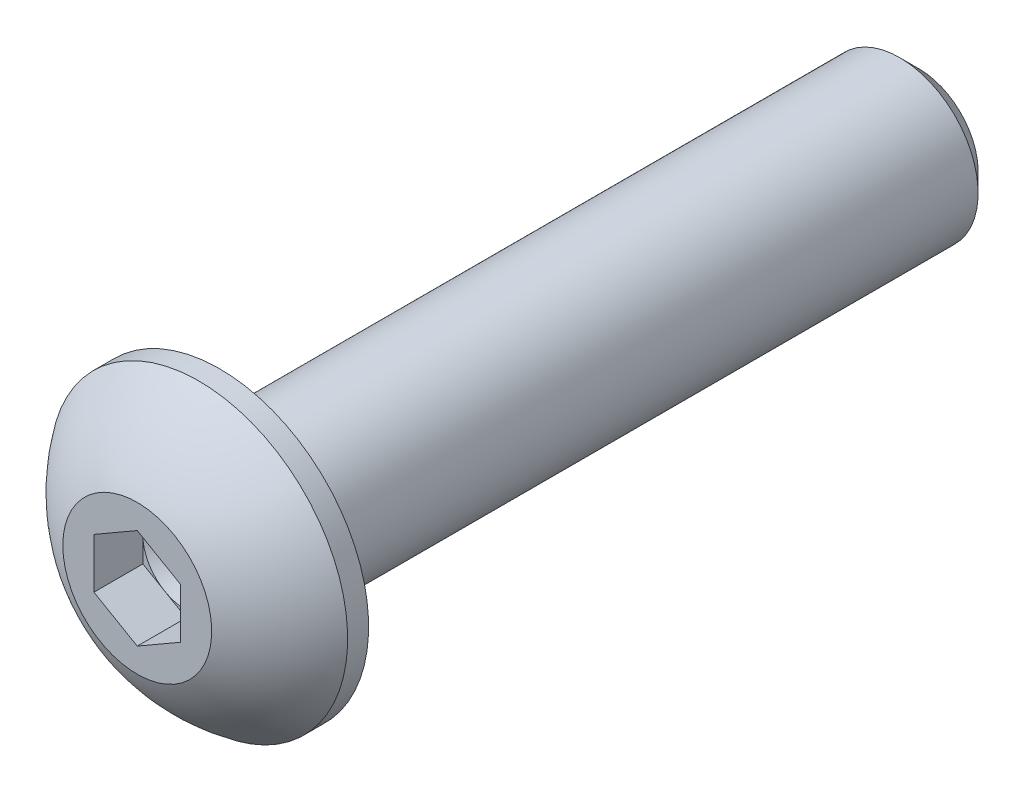
ISO-10303-21;
HEADER;
FILE_DESCRIPTION(('STEP AP214'),'2;1');
FILE_NAME('part.step','',(''),(''),'','','');
FILE_SCHEMA(('AUTOMOTIVE_DESIGN { 1 0 10303 214 1 1 1 1 }'));
ENDSEC;
DATA;
#1=APPLICATION_CONTEXT('core data for automotive mechanical design processes');
#2=APPLICATION_PROTOCOL_DEFINITION('international standard','automotive_design',2000,#1);
#3=PRODUCT_CONTEXT('',#1,'mechanical');
#4=PRODUCT('Part','Part','',(#3));
#5=PRODUCT_RELATED_PRODUCT_CATEGORY('part','',(#4));
#6=PRODUCT_DEFINITION_FORMATION('','',#4);
#7=PRODUCT_DEFINITION_CONTEXT('part definition',#1,'design');
#8=PRODUCT_DEFINITION('design','',#6,#7);
#9=PRODUCT_DEFINITION_SHAPE('','',#8);
#10=(LENGTH_UNIT() NAMED_UNIT(*) SI_UNIT(.MILLI.,.METRE.));
#11=(NAMED_UNIT(*) PLANE_ANGLE_UNIT() SI_UNIT($,.RADIAN.));
#12=(NAMED_UNIT(*) SI_UNIT($,.STERADIAN.) SOLID_ANGLE_UNIT());
#13=UNCERTAINTY_MEASURE_WITH_UNIT(LENGTH_MEASURE(1.E-05),#10,'distance_accuracy_value','');
#14=(GEOMETRIC_REPRESENTATION_CONTEXT(3) GLOBAL_UNCERTAINTY_ASSIGNED_CONTEXT((#13)) GLOBAL_UNIT_ASSIGNED_CONTEXT((#10,
#11,#12)) REPRESENTATION_CONTEXT('',''));
#15=CARTESIAN_POINT('',(0.,0.,0.));
#16=DIRECTION('',(0.,0.,1.));
#17=DIRECTION('',(1.,0.,0.));
#18=AXIS2_PLACEMENT_3D('',#15,#16,#17);
#19=CARTESIAN_POINT('',(0.,0.,-0.889));
#20=DIRECTION('',(0.,0.,1.));
#21=DIRECTION('',(1.,0.,0.));
#22=AXIS2_PLACEMENT_3D('',#19,#20,#21);
#23=PLANE('',#22);
#24=CARTESIAN_POINT('',(0.,0.,-0.889));
#25=DIRECTION('',(0.,0.,1.));
#26=DIRECTION('',(1.,0.,0.));
#27=AXIS2_PLACEMENT_3D('',#24,#25,#26);
#28=CIRCLE('',#27,0.7874);
#29=CARTESIAN_POINT('',(0.7874,0.,-0.889));
#30=VERTEX_POINT('',#29);
#31=CARTESIAN_POINT('',(0.3937,0.681908402939867,-0.889));
#32=VERTEX_POINT('',#31);
#33=EDGE_CURVE('E96',#30,#32,#28,.T.);
#34=ORIENTED_EDGE('',*,*,#33,.F.);
#35=DIRECTION('',(0.,-1.,0.));
#36=VECTOR('',#35,1.);
#37=CARTESIAN_POINT('',(0.7874,0.,-0.889));
#38=LINE('',#37,#36);
#39=CARTESIAN_POINT('',(0.7874,0.454605601959912,-0.889));
#40=VERTEX_POINT('',#39);
#41=EDGE_CURVE('E120',#40,#30,#38,.T.);
#42=ORIENTED_EDGE('',*,*,#41,.F.);
#43=DIRECTION('',(0.866025403784439,-0.5,0.));
#44=VECTOR('',#43,1.);
#45=CARTESIAN_POINT('',(0.3937,0.681908402939867,-0.889));
#46=LINE('',#45,#44);
#47=EDGE_CURVE('E118',#32,#40,#46,.T.);
#48=ORIENTED_EDGE('',*,*,#47,.F.);
#49=EDGE_LOOP('',(#34,#42,#48));
#50=FACE_BOUND('',#49,.T.);
#51=ADVANCED_FACE('F17',(#50),#23,.T.);
#52=CARTESIAN_POINT('',(-0.3937,0.681908402939867,-0.889));
#53=VERTEX_POINT('',#52);
#54=EDGE_CURVE('E98',#32,#53,#28,.T.);
#55=ORIENTED_EDGE('',*,*,#54,.F.);
#56=CARTESIAN_POINT('',(0.,0.909211203919823,-0.889));
#57=VERTEX_POINT('',#56);
#58=EDGE_CURVE('E113',#57,#32,#46,.T.);
#59=ORIENTED_EDGE('',*,*,#58,.F.);
#60=DIRECTION('',(0.866025403784439,0.5,0.));
#61=VECTOR('',#60,1.);
#62=CARTESIAN_POINT('',(-0.3937,0.681908402939867,-0.889));
#63=LINE('',#62,#61);
#64=EDGE_CURVE('E114',#53,#57,#63,.T.);
#65=ORIENTED_EDGE('',*,*,#64,.F.);
#66=EDGE_LOOP('',(#55,#59,#65));
#67=FACE_BOUND('',#66,.T.);
#68=ADVANCED_FACE('F111',(#67),#23,.T.);
#69=CARTESIAN_POINT('',(-0.7874,0.,-0.889));
#70=VERTEX_POINT('',#69);
#71=EDGE_CURVE('E117',#53,#70,#28,.T.);
#72=ORIENTED_EDGE('',*,*,#71,.F.);
#73=CARTESIAN_POINT('',(-0.7874,0.454605601959911,-0.889));
#74=VERTEX_POINT('',#73);
#75=EDGE_CURVE('E135',#74,#53,#63,.T.);
#76=ORIENTED_EDGE('',*,*,#75,.F.);
#77=DIRECTION('',(0.,1.,0.));
#78=VECTOR('',#77,1.);
#79=CARTESIAN_POINT('',(-0.7874,0.,-0.889));
#80=LINE('',#79,#78);
#81=EDGE_CURVE('E139',#70,#74,#80,.T.);
#82=ORIENTED_EDGE('',*,*,#81,.F.);
#83=EDGE_LOOP('',(#72,#76,#82));
#84=FACE_BOUND('',#83,.T.);
#85=ADVANCED_FACE('F228',(#84),#23,.T.);
#86=CARTESIAN_POINT('',(-0.3937,-0.681908402939867,-0.889));
#87=VERTEX_POINT('',#86);
#88=EDGE_CURVE('E253',#70,#87,#28,.T.);
#89=ORIENTED_EDGE('',*,*,#88,.F.);
#90=CARTESIAN_POINT('',(-0.7874,-0.454605601959911,-0.889));
#91=VERTEX_POINT('',#90);
#92=EDGE_CURVE('E140',#91,#70,#80,.T.);
#93=ORIENTED_EDGE('',*,*,#92,.F.);
#94=DIRECTION('',(-0.866025403784439,0.5,0.));
#95=VECTOR('',#94,1.);
#96=CARTESIAN_POINT('',(-0.3937,-0.681908402939867,-0.889));
#97=LINE('',#96,#95);
#98=EDGE_CURVE('E144',#87,#91,#97,.T.);
#99=ORIENTED_EDGE('',*,*,#98,.F.);
#100=EDGE_LOOP('',(#89,#93,#99));
#101=FACE_BOUND('',#100,.T.);
#102=ADVANCED_FACE('F240',(#101),#23,.T.);
#103=CARTESIAN_POINT('',(0.3937,-0.681908402939867,-0.889));
#104=VERTEX_POINT('',#103);
#105=EDGE_CURVE('E33',#87,#104,#28,.T.);
#106=ORIENTED_EDGE('',*,*,#105,.F.);
#107=CARTESIAN_POINT('',(0.,-0.909211203919823,-0.889));
#108=VERTEX_POINT('',#107);
#109=EDGE_CURVE('E145',#108,#87,#97,.T.);
#110=ORIENTED_EDGE('',*,*,#109,.F.);
#111=DIRECTION('',(-0.866025403784438,-0.5,0.));
#112=VECTOR('',#111,1.);
#113=CARTESIAN_POINT('',(0.3937,-0.681908402939867,-0.889));
#114=LINE('',#113,#112);
#115=EDGE_CURVE('E149',#104,#108,#114,.T.);
#116=ORIENTED_EDGE('',*,*,#115,.F.);
#117=EDGE_LOOP('',(#106,#110,#116));
#118=FACE_BOUND('',#117,.T.);
#119=ADVANCED_FACE('F233',(#118),#23,.T.);
#120=CARTESIAN_POINT('',(-0.676275,0.,0.));
#121=DIRECTION('',(0.,0.,1.));
#122=DIRECTION('',(1.,0.,0.));
#123=AXIS2_PLACEMENT_3D('',#120,#121,#122);
#124=PLANE('',#123);
#125=CARTESIAN_POINT('',(0.,0.,0.));
#126=DIRECTION('',(0.,0.,-1.));
#127=DIRECTION('',(-1.,0.,0.));
#128=AXIS2_PLACEMENT_3D('',#125,#126,#127);
#129=CIRCLE('',#128,1.35255);
#130=CARTESIAN_POINT('',(-1.35255000000001,0.,0.));
#131=VERTEX_POINT('',#130);
#132=EDGE_CURVE('E198',#131,#131,#129,.T.);
#133=ORIENTED_EDGE('',*,*,#132,.F.);
#134=EDGE_LOOP('',(#133));
#135=FACE_BOUND('',#134,.T.);
#136=DIRECTION('',(0.866025403784439,0.5,0.));
#137=VECTOR('',#136,1.);
#138=CARTESIAN_POINT('',(-0.3937,0.681908402939867,0.));
#139=LINE('',#138,#137);
#140=CARTESIAN_POINT('',(-0.7874,0.454605601959911,0.));
#141=VERTEX_POINT('',#140);
#142=CARTESIAN_POINT('',(0.,0.909211203919823,0.));
#143=VERTEX_POINT('',#142);
#144=EDGE_CURVE('E161',#141,#143,#139,.T.);
#145=ORIENTED_EDGE('',*,*,#144,.T.);
#146=DIRECTION('',(0.866025403784439,-0.5,0.));
#147=VECTOR('',#146,1.);
#148=CARTESIAN_POINT('',(0.3937,0.681908402939867,0.));
#149=LINE('',#148,#147);
#150=CARTESIAN_POINT('',(0.7874,0.454605601959912,0.));
#151=VERTEX_POINT('',#150);
#152=EDGE_CURVE('E106',#143,#151,#149,.T.);
#153=ORIENTED_EDGE('',*,*,#152,.T.);
#154=DIRECTION('',(0.,-1.,0.));
#155=VECTOR('',#154,1.);
#156=CARTESIAN_POINT('',(0.7874,0.,0.));
#157=LINE('',#156,#155);
#158=CARTESIAN_POINT('',(0.7874,-0.454605601959912,0.));
#159=VERTEX_POINT('',#158);
#160=EDGE_CURVE('E124',#151,#159,#157,.T.);
#161=ORIENTED_EDGE('',*,*,#160,.T.);
#162=DIRECTION('',(-0.866025403784438,-0.5,0.));
#163=VECTOR('',#162,1.);
#164=CARTESIAN_POINT('',(0.3937,-0.681908402939867,0.));
#165=LINE('',#164,#163);
#166=CARTESIAN_POINT('',(0.,-0.909211203919823,0.));
#167=VERTEX_POINT('',#166);
#168=EDGE_CURVE('E41',#159,#167,#165,.T.);
#169=ORIENTED_EDGE('',*,*,#168,.T.);
#170=DIRECTION('',(-0.866025403784439,0.5,0.));
#171=VECTOR('',#170,1.);
#172=CARTESIAN_POINT('',(-0.3937,-0.681908402939867,0.));
#173=LINE('',#172,#171);
#174=CARTESIAN_POINT('',(-0.7874,-0.454605601959911,0.));
#175=VERTEX_POINT('',#174);
#176=EDGE_CURVE('E169',#167,#175,#173,.T.);
#177=ORIENTED_EDGE('',*,*,#176,.T.);
#178=DIRECTION('',(0.,1.,0.));
#179=VECTOR('',#178,1.);
#180=CARTESIAN_POINT('',(-0.7874,0.,0.));
#181=LINE('',#180,#179);
#182=EDGE_CURVE('E165',#175,#141,#181,.T.);
#183=ORIENTED_EDGE('',*,*,#182,.T.);
#184=EDGE_LOOP('',(#145,#153,#161,#169,#177,#183));
#185=FACE_BOUND('',#184,.T.);
#186=ADVANCED_FACE('F239',(#135,#185),#124,.T.);
#187=CARTESIAN_POINT('',(0.,0.,1.48381805047393));
#188=DIRECTION('',(0.,0.,-1.));
#189=DIRECTION('',(-1.,0.,0.));
#190=AXIS2_PLACEMENT_3D('',#187,#188,#189);
#191=CYLINDRICAL_SURFACE('',#190,2.7051);
#192=CARTESIAN_POINT('',(0.,0.,-1.1176));
#193=DIRECTION('',(0.,0.,-1.));
#194=DIRECTION('',(-1.,0.,0.));
#195=AXIS2_PLACEMENT_3D('',#192,#193,#194);
#196=CIRCLE('',#195,2.7051);
#197=CARTESIAN_POINT('',(-2.7051,0.,-1.1176));
#198=VERTEX_POINT('',#197);
#199=EDGE_CURVE('E194',#198,#198,#196,.T.);
#200=ORIENTED_EDGE('',*,*,#199,.T.);
#201=EDGE_LOOP('',(#200));
#202=FACE_BOUND('',#201,.T.);
#203=CARTESIAN_POINT('',(0.,0.,-1.4986));
#204=DIRECTION('',(0.,0.,-1.));
#205=DIRECTION('',(-1.,0.,0.));
#206=AXIS2_PLACEMENT_3D('',#203,#204,#205);
#207=CIRCLE('',#206,2.7051);
#208=CARTESIAN_POINT('',(-2.7051,0.,-1.4986));
#209=VERTEX_POINT('',#208);
#210=EDGE_CURVE('E209',#209,#209,#207,.T.);
#211=ORIENTED_EDGE('',*,*,#210,.F.);
#212=EDGE_LOOP('',(#211));
#213=FACE_BOUND('',#212,.T.);
#214=ADVANCED_FACE('F245',(#202,#213),#191,.T.);
#215=CARTESIAN_POINT('',(-2.19075,0.,-1.4986));
#216=DIRECTION('',(0.,0.,-1.));
#217=DIRECTION('',(-1.,0.,0.));
#218=AXIS2_PLACEMENT_3D('',#215,#216,#217);
#219=PLANE('',#218);
#220=ORIENTED_EDGE('',*,*,#210,.T.);
#221=EDGE_LOOP('',(#220));
#222=FACE_BOUND('',#221,.T.);
#223=CARTESIAN_POINT('',(0.,0.,-1.4986));
#224=DIRECTION('',(0.,0.,-1.));
#225=DIRECTION('',(-1.,0.,0.));
#226=AXIS2_PLACEMENT_3D('',#223,#224,#225);
#227=CIRCLE('',#226,1.6764);
#228=CARTESIAN_POINT('',(-1.6764,0.,-1.4986));
#229=VERTEX_POINT('',#228);
#230=EDGE_CURVE('E205',#229,#229,#227,.T.);
#231=ORIENTED_EDGE('',*,*,#230,.F.);
#232=EDGE_LOOP('',(#231));
#233=FACE_BOUND('',#232,.T.);
#234=ADVANCED_FACE('F305',(#222,#233),#219,.T.);
#235=CARTESIAN_POINT('',(0.,0.,-1.7526));
#236=DIRECTION('',(0.,0.,-1.));
#237=DIRECTION('',(-1.,0.,0.));
#238=AXIS2_PLACEMENT_3D('',#235,#236,#237);
#239=TOROIDAL_SURFACE('',#238,1.6764,0.254);
#240=ORIENTED_EDGE('',*,*,#230,.T.);
#241=EDGE_LOOP('',(#240));
#242=FACE_BOUND('',#241,.T.);
#243=CARTESIAN_POINT('',(0.,0.,-1.7526));
#244=DIRECTION('',(0.,0.,-1.));
#245=DIRECTION('',(-1.,0.,0.));
#246=AXIS2_PLACEMENT_3D('',#243,#244,#245);
#247=CIRCLE('',#246,1.4224);
#248=CARTESIAN_POINT('',(-1.4224,0.,-1.7526));
#249=VERTEX_POINT('',#248);
#250=EDGE_CURVE('E201',#249,#249,#247,.T.);
#251=ORIENTED_EDGE('',*,*,#250,.F.);
#252=EDGE_LOOP('',(#251));
#253=FACE_BOUND('',#252,.T.);
#254=ADVANCED_FACE('F301',(#242,#253),#239,.F.);
#255=CARTESIAN_POINT('',(0.,0.,1.48381805047393));
#256=DIRECTION('',(0.,0.,-1.));
#257=DIRECTION('',(-1.,0.,0.));
#258=AXIS2_PLACEMENT_3D('',#255,#256,#257);
#259=CYLINDRICAL_SURFACE('',#258,1.4224);
#260=CARTESIAN_POINT('',(0.,0.,-13.854896169375));
#261=DIRECTION('',(0.,0.,-1.));
#262=DIRECTION('',(-1.,0.,0.));
#263=AXIS2_PLACEMENT_3D('',#260,#261,#262);
#264=CIRCLE('',#263,1.4224);
#265=CARTESIAN_POINT('',(-1.4224,0.,-13.854896169375));
#266=VERTEX_POINT('',#265);
#267=EDGE_CURVE('E11',#266,#266,#264,.F.);
#268=ORIENTED_EDGE('',*,*,#267,.T.);
#269=EDGE_LOOP('',(#268));
#270=FACE_BOUND('',#269,.T.);
#271=ORIENTED_EDGE('',*,*,#250,.T.);
#272=EDGE_LOOP('',(#271));
#273=FACE_BOUND('',#272,.T.);
#274=ADVANCED_FACE('F298',(#270,#273),#259,.T.);
#275=CARTESIAN_POINT('',(-0.7112,0.,-14.1986));
#276=DIRECTION('',(0.,0.,-1.));
#277=DIRECTION('',(-1.,0.,0.));
#278=AXIS2_PLACEMENT_3D('',#275,#276,#277);
#279=PLANE('',#278);
#280=CARTESIAN_POINT('',(0.,0.,-14.1986));
#281=DIRECTION('',(0.,0.,-1.));
#282=DIRECTION('',(-1.,0.,0.));
#283=AXIS2_PLACEMENT_3D('',#280,#281,#282);
#284=CIRCLE('',#283,1.078696169375);
#285=CARTESIAN_POINT('',(-1.078696169375,0.,-14.1986));
#286=VERTEX_POINT('',#285);
#287=EDGE_CURVE('E26',#286,#286,#284,.T.);
#288=ORIENTED_EDGE('',*,*,#287,.T.);
#289=EDGE_LOOP('',(#288));
#290=FACE_BOUND('',#289,.T.);
#291=ADVANCED_FACE('F217',(#290),#279,.T.);
#292=CARTESIAN_POINT('',(0.,0.,-3.01413934659091));
#293=DIRECTION('',(0.,0.,-1.));
#294=DIRECTION('',(-1.,0.,0.));
#295=AXIS2_PLACEMENT_3D('',#292,#293,#294);
#296=SPHERICAL_SURFACE('',#295,3.30369906365085);
#297=CARTESIAN_POINT('',(-2.7051,0.,-1.1176));
#298=CARTESIAN_POINT('',(-2.69448072515173,0.,-1.10245333170204));
#299=CARTESIAN_POINT('',(-2.6837342092802,0.,-1.08739587235026));
#300=CARTESIAN_POINT('',(-2.66198978369861,0.,-1.05746357954938));
#301=CARTESIAN_POINT('',(-2.65099187398855,0.,-1.04258874610028));
#302=CARTESIAN_POINT('',(-2.62874774893787,0.,-1.01302591311507));
#303=CARTESIAN_POINT('',(-2.61750153359726,0.,-0.998337913578966));
#304=CARTESIAN_POINT('',(-2.59476397456268,0.,-0.96915288990507));
#305=CARTESIAN_POINT('',(-2.58327263086873,0.,-0.954655865767278));
#306=CARTESIAN_POINT('',(-2.56004805647789,0.,-0.925856884188922));
#307=CARTESIAN_POINT('',(-2.54831482578101,0.,-0.911554926748357));
#308=CARTESIAN_POINT('',(-2.52460978835082,0.,-0.883150113831521));
#309=CARTESIAN_POINT('',(-2.51263798161752,0.,-0.86904725835525));
#310=CARTESIAN_POINT('',(-2.48845917003253,0.,-0.841044628720583));
#311=CARTESIAN_POINT('',(-2.47625216518085,0.,-0.827144854562187));
#312=CARTESIAN_POINT('',(-2.45160640173926,0.,-0.799552309543735));
#313=CARTESIAN_POINT('',(-2.43916764314934,0.,-0.78585953868368));
#314=CARTESIAN_POINT('',(-2.41406188197738,0.,-0.758684863852871));
#315=CARTESIAN_POINT('',(-2.40139487939533,0.,-0.745202959882118));
#316=CARTESIAN_POINT('',(-2.37583620439415,0.,-0.71845382291703));
#317=CARTESIAN_POINT('',(-2.36294453197501,0.,-0.705186589922696));
#318=CARTESIAN_POINT('',(-2.33694015484621,0.,-0.678870538426824));
#319=CARTESIAN_POINT('',(-2.32382745013655,0.,-0.665821719925286));
#320=CARTESIAN_POINT('',(-2.2973847083408,0.,-0.639946179302631));
#321=CARTESIAN_POINT('',(-2.28405467125472,0.,-0.627119457181515));
#322=CARTESIAN_POINT('',(-2.25718102594315,0.,-0.601691728540148));
#323=CARTESIAN_POINT('',(-2.24363741771767,0.,-0.589090722019898));
#324=CARTESIAN_POINT('',(-2.21634045162613,0.,-0.564117980112197));
#325=CARTESIAN_POINT('',(-2.20258709376008,0.,-0.551746244724746));
#326=CARTESIAN_POINT('',(-2.17487450906973,0.,-0.52723553592286));
#327=CARTESIAN_POINT('',(-2.16091528224542,0.,-0.515096562508424));
#328=CARTESIAN_POINT('',(-2.13279489840938,0.,-0.491054802816074));
#329=CARTESIAN_POINT('',(-2.11863374139764,0.,-0.47915201653816));
#330=CARTESIAN_POINT('',(-2.09011349293469,0.,-0.455585989639197));
#331=CARTESIAN_POINT('',(-2.07575440148348,0.,-0.443922749018149));
#332=CARTESIAN_POINT('',(-2.04684233573922,0.,-0.420839104362454));
#333=CARTESIAN_POINT('',(-2.03228936144617,0.,-0.409418700327807));
#334=CARTESIAN_POINT('',(-2.00299363632234,0.,-0.386823951255064));
#335=CARTESIAN_POINT('',(-1.98825088549157,0.,-0.375649606216968));
#336=CARTESIAN_POINT('',(-1.95857976714423,0.,-0.353550128118844));
#337=CARTESIAN_POINT('',(-1.94365139962767,0.,-0.342624995058815));
#338=CARTESIAN_POINT('',(-1.91361326013479,0.,-0.321027023580069));
#339=CARTESIAN_POINT('',(-1.89850348815846,0.,-0.310354185161351));
#340=CARTESIAN_POINT('',(-1.8681068031576,0.,-0.289263814440333));
#341=CARTESIAN_POINT('',(-1.85281989013307,0.,-0.278846282138034));
#342=CARTESIAN_POINT('',(-1.82207323642989,0.,-0.258269463087292));
#343=CARTESIAN_POINT('',(-1.80661349575124,0.,-0.248110176338849));
#344=CARTESIAN_POINT('',(-1.77552554889962,0.,-0.228052714965474));
#345=CARTESIAN_POINT('',(-1.75989734272667,0.,-0.218154540340541));
#346=CARTESIAN_POINT('',(-1.72847687457993,0.,-0.198622096109889));
#347=CARTESIAN_POINT('',(-1.71268461260615,0.,-0.18898782650417));
#348=CARTESIAN_POINT('',(-1.68094048884535,0.,-0.169985910735668));
#349=CARTESIAN_POINT('',(-1.66498862705833,0.,-0.160618264572885));
#350=CARTESIAN_POINT('',(-1.63292980467793,0.,-0.142152238912209));
#351=CARTESIAN_POINT('',(-1.61682284408455,0.,-0.133053859414317));
#352=CARTESIAN_POINT('',(-1.58445836891283,0.,-0.115128934218774));
#353=CARTESIAN_POINT('',(-1.56820085433448,0.,-0.106302388521123));
#354=CARTESIAN_POINT('',(-1.53553985830296,0.,-0.0889236217692724));
#355=CARTESIAN_POINT('',(-1.51913637684979,0.,-0.0803714007150717));
#356=CARTESIAN_POINT('',(-1.48618807608146,0.,-0.0635436951621508));
#357=CARTESIAN_POINT('',(-1.46964325676629,0.,-0.0552682106634306));
#358=CARTESIAN_POINT('',(-1.4364169464938,0.,-0.0389963177478053));
#359=CARTESIAN_POINT('',(-1.41973545553648,0.,-0.0309999093309001));
#360=CARTESIAN_POINT('',(-1.38624051673977,0.,-0.0152884080914967));
#361=CARTESIAN_POINT('',(-1.36942706890038,0.,-0.00757331526899838));
#362=CARTESIAN_POINT('',(-1.35255000000001,0.,0.));
#363=B_SPLINE_CURVE_WITH_KNOTS('',3,(#297,#298,#299,#300,#301,#302,#303,#304,#305,#306,#307,
#308,#309,#310,#311,#312,#313,#314,#315,#316,#317,#318,#319,#320,#321,#322,#323,#324,#325,#326,
#327,#328,#329,#330,#331,#332,#333,#334,#335,#336,#337,#338,#339,#340,#341,#342,#343,#344,#345,
#346,#347,#348,#349,#350,#351,#352,#353,#354,#355,#356,#357,#358,#359,#360,#361,#362),
.UNSPECIFIED.,.F.,.F.,(4,2,2,2,2,2,2,2,2,2,2,2,2,2,2,2,2,2,2,2,2,2,2,2,2,2,2,2,2,2,2,2,4),(0.,
0.0554945270104909,0.110989054020981,0.166483581031473,0.221978108041963,0.277472635052454,
0.332967162062945,0.388461689073436,0.443956216083926,0.499450743094417,0.554945270104908,
0.610439797115399,0.66593432412589,0.72142885113638,0.776923378146871,0.832417905157362,
0.887912432167853,0.943406959178343,0.998901486188835,1.05439601319933,1.10989054020982,
1.16538506722031,1.2208795942308,1.27637412124129,1.33186864825178,1.38736317526227,
1.44285770227276,1.49835222928325,1.55384675629374,1.60934128330423,1.66483581031472,
1.72033033732521,1.77582486433571),.UNSPECIFIED.);
#364=EDGE_CURVE('BSEAM292',#198,#131,#363,.T.);
#365=ORIENTED_EDGE('',*,*,#199,.F.);
#366=ORIENTED_EDGE('',*,*,#132,.T.);
#367=ORIENTED_EDGE('',*,*,#364,.T.);
#368=ORIENTED_EDGE('',*,*,#364,.F.);
#369=EDGE_LOOP('',(#365,#367,#366,#368));
#370=FACE_BOUND('',#369,.T.);
#371=ADVANCED_FACE('F292',(#370),#296,.T.);
#372=CARTESIAN_POINT('',(0.3937,0.681908402939867,-0.889));
#373=DIRECTION('',(-0.5,-0.866025403784439,0.));
#374=DIRECTION('',(0.866025403784439,-0.5,0.));
#375=AXIS2_PLACEMENT_3D('',#372,#373,#374);
#376=PLANE('',#375);
#377=ORIENTED_EDGE('',*,*,#152,.F.);
#378=DIRECTION('',(0.,0.,1.));
#379=VECTOR('',#378,1.);
#380=CARTESIAN_POINT('',(0.,0.909211203919823,-0.889));
#381=LINE('',#380,#379);
#382=EDGE_CURVE('E129',#57,#143,#381,.T.);
#383=ORIENTED_EDGE('',*,*,#382,.F.);
#384=ORIENTED_EDGE('',*,*,#58,.T.);
#385=ORIENTED_EDGE('',*,*,#47,.T.);
#386=DIRECTION('',(0.,0.,1.));
#387=VECTOR('',#386,1.);
#388=CARTESIAN_POINT('',(0.7874,0.454605601959912,-0.889));
#389=LINE('',#388,#387);
#390=EDGE_CURVE('E157',#40,#151,#389,.T.);
#391=ORIENTED_EDGE('',*,*,#390,.T.);
#392=EDGE_LOOP('',(#377,#383,#384,#385,#391));
#393=FACE_BOUND('',#392,.T.);
#394=ADVANCED_FACE('F128',(#393),#376,.T.);
#395=CARTESIAN_POINT('',(-0.3937,0.681908402939867,-0.889));
#396=DIRECTION('',(0.5,-0.866025403784438,0.));
#397=DIRECTION('',(0.866025403784438,0.5,0.));
#398=AXIS2_PLACEMENT_3D('',#395,#396,#397);
#399=PLANE('',#398);
#400=ORIENTED_EDGE('',*,*,#144,.F.);
#401=DIRECTION('',(0.,0.,1.));
#402=VECTOR('',#401,1.);
#403=CARTESIAN_POINT('',(-0.7874,0.454605601959911,-0.889));
#404=LINE('',#403,#402);
#405=EDGE_CURVE('E189',#74,#141,#404,.T.);
#406=ORIENTED_EDGE('',*,*,#405,.F.);
#407=ORIENTED_EDGE('',*,*,#75,.T.);
#408=ORIENTED_EDGE('',*,*,#64,.T.);
#409=ORIENTED_EDGE('',*,*,#382,.T.);
#410=EDGE_LOOP('',(#400,#406,#407,#408,#409));
#411=FACE_BOUND('',#410,.T.);
#412=ADVANCED_FACE('F275',(#411),#399,.T.);
#413=CARTESIAN_POINT('',(-0.7874,0.,-0.889));
#414=DIRECTION('',(1.,0.,0.));
#415=DIRECTION('',(0.,0.,-1.));
#416=AXIS2_PLACEMENT_3D('',#413,#414,#415);
#417=PLANE('',#416);
#418=ORIENTED_EDGE('',*,*,#182,.F.);
#419=DIRECTION('',(0.,0.,1.));
#420=VECTOR('',#419,1.);
#421=CARTESIAN_POINT('',(-0.7874,-0.454605601959911,-0.889));
#422=LINE('',#421,#420);
#423=EDGE_CURVE('E186',#91,#175,#422,.T.);
#424=ORIENTED_EDGE('',*,*,#423,.F.);
#425=ORIENTED_EDGE('',*,*,#92,.T.);
#426=ORIENTED_EDGE('',*,*,#81,.T.);
#427=ORIENTED_EDGE('',*,*,#405,.T.);
#428=EDGE_LOOP('',(#418,#424,#425,#426,#427));
#429=FACE_BOUND('',#428,.T.);
#430=ADVANCED_FACE('F280',(#429),#417,.T.);
#431=CARTESIAN_POINT('',(-0.3937,-0.681908402939867,-0.889));
#432=DIRECTION('',(0.5,0.866025403784439,0.));
#433=DIRECTION('',(-0.866025403784439,0.5,0.));
#434=AXIS2_PLACEMENT_3D('',#431,#432,#433);
#435=PLANE('',#434);
#436=ORIENTED_EDGE('',*,*,#176,.F.);
#437=DIRECTION('',(0.,0.,1.));
#438=VECTOR('',#437,1.);
#439=CARTESIAN_POINT('',(0.,-0.909211203919823,-0.889));
#440=LINE('',#439,#438);
#441=EDGE_CURVE('E183',#108,#167,#440,.T.);
#442=ORIENTED_EDGE('',*,*,#441,.F.);
#443=ORIENTED_EDGE('',*,*,#109,.T.);
#444=ORIENTED_EDGE('',*,*,#98,.T.);
#445=ORIENTED_EDGE('',*,*,#423,.T.);
#446=EDGE_LOOP('',(#436,#442,#443,#444,#445));
#447=FACE_BOUND('',#446,.T.);
#448=ADVANCED_FACE('F262',(#447),#435,.T.);
#449=CARTESIAN_POINT('',(0.3937,-0.681908402939867,-0.889));
#450=DIRECTION('',(-0.5,0.866025403784438,0.));
#451=DIRECTION('',(-0.866025403784438,-0.5,0.));
#452=AXIS2_PLACEMENT_3D('',#449,#450,#451);
#453=PLANE('',#452);
#454=ORIENTED_EDGE('',*,*,#168,.F.);
#455=DIRECTION('',(0.,0.,1.));
#456=VECTOR('',#455,1.);
#457=CARTESIAN_POINT('',(0.7874,-0.454605601959912,-0.889));
#458=LINE('',#457,#456);
#459=CARTESIAN_POINT('',(0.7874,-0.454605601959912,-0.889));
#460=VERTEX_POINT('',#459);
#461=EDGE_CURVE('E180',#460,#159,#458,.T.);
#462=ORIENTED_EDGE('',*,*,#461,.F.);
#463=EDGE_CURVE('E150',#460,#104,#114,.T.);
#464=ORIENTED_EDGE('',*,*,#463,.T.);
#465=ORIENTED_EDGE('',*,*,#115,.T.);
#466=ORIENTED_EDGE('',*,*,#441,.T.);
#467=EDGE_LOOP('',(#454,#462,#464,#465,#466));
#468=FACE_BOUND('',#467,.T.);
#469=ADVANCED_FACE('F236',(#468),#453,.T.);
#470=CARTESIAN_POINT('',(0.7874,0.,-0.889));
#471=DIRECTION('',(-1.,0.,0.));
#472=DIRECTION('',(0.,0.,1.));
#473=AXIS2_PLACEMENT_3D('',#470,#471,#472);
#474=PLANE('',#473);
#475=ORIENTED_EDGE('',*,*,#160,.F.);
#476=ORIENTED_EDGE('',*,*,#390,.F.);
#477=ORIENTED_EDGE('',*,*,#41,.T.);
#478=EDGE_CURVE('E154',#30,#460,#38,.T.);
#479=ORIENTED_EDGE('',*,*,#478,.T.);
#480=ORIENTED_EDGE('',*,*,#461,.T.);
#481=EDGE_LOOP('',(#475,#476,#477,#479,#480));
#482=FACE_BOUND('',#481,.T.);
#483=ADVANCED_FACE('F231',(#482),#474,.T.);
#484=EDGE_CURVE('E100',#104,#30,#28,.T.);
#485=ORIENTED_EDGE('',*,*,#484,.F.);
#486=ORIENTED_EDGE('',*,*,#463,.F.);
#487=ORIENTED_EDGE('',*,*,#478,.F.);
#488=EDGE_LOOP('',(#485,#486,#487));
#489=FACE_BOUND('',#488,.T.);
#490=ADVANCED_FACE('F93',(#489),#23,.T.);
#491=CARTESIAN_POINT('',(0.,0.,-0.889));
#492=DIRECTION('',(0.,0.,1.));
#493=DIRECTION('',(1.,0.,0.));
#494=AXIS2_PLACEMENT_3D('',#491,#492,#493);
#495=CONICAL_SURFACE('',#494,0.7874,1.0471975511966);
#496=CARTESIAN_POINT('',(0.,0.,-1.34360560195991));
#497=VERTEX_POINT('',#496);
#498=VERTEX_LOOP('',#497);
#499=FACE_BOUND('',#498,.T.);
#500=ORIENTED_EDGE('',*,*,#33,.T.);
#501=ORIENTED_EDGE('',*,*,#54,.T.);
#502=ORIENTED_EDGE('',*,*,#71,.T.);
#503=ORIENTED_EDGE('',*,*,#88,.T.);
#504=ORIENTED_EDGE('',*,*,#105,.T.);
#505=ORIENTED_EDGE('',*,*,#484,.T.);
#506=EDGE_LOOP('',(#500,#501,#502,#503,#504,#505));
#507=FACE_BOUND('',#506,.T.);
#508=ADVANCED_FACE('F91',(#499,#507),#495,.F.);
#509=CARTESIAN_POINT('',(0.,0.,-14.1986));
#510=DIRECTION('',(0.,0.,1.));
#511=DIRECTION('',(1.,0.,0.));
#512=AXIS2_PLACEMENT_3D('',#509,#510,#511);
#513=CONICAL_SURFACE('',#512,1.078696169375,0.785398163397448);
#514=ORIENTED_EDGE('',*,*,#267,.F.);
#515=EDGE_LOOP('',(#514));
#516=FACE_BOUND('',#515,.T.);
#517=ORIENTED_EDGE('',*,*,#287,.F.);
#518=EDGE_LOOP('',(#517));
#519=FACE_BOUND('',#518,.T.);
#520=ADVANCED_FACE('F19',(#516,#519),#513,.T.);
#521=CLOSED_SHELL('',(#51,#68,#85,#102,#119,#186,#214,#234,#254,#274,#291,#371,#394,#412,#430,
#448,#469,#483,#490,#508,#520));
#522=MANIFOLD_SOLID_BREP('B1',#521);
#523=ADVANCED_BREP_SHAPE_REPRESENTATION('',(#18,#522),#14);
#524=SHAPE_DEFINITION_REPRESENTATION(#9,#523);
ENDSEC;
END-ISO-10303-21;
